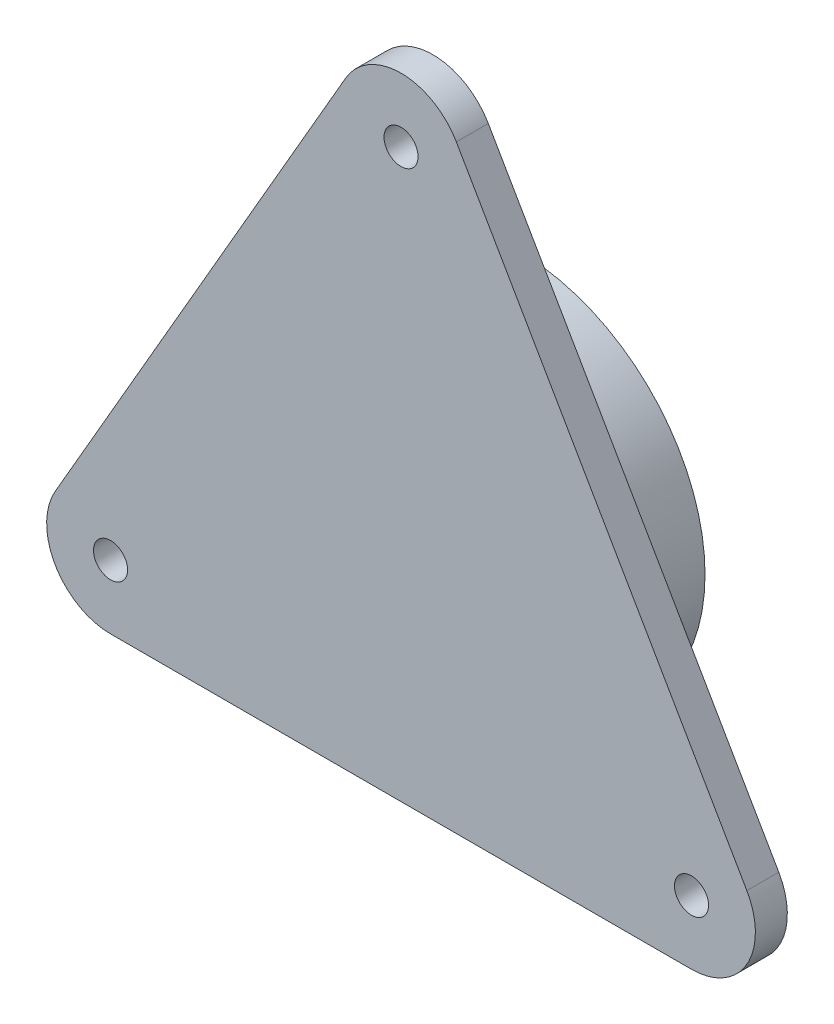
ISO-10303-21;
HEADER;
FILE_DESCRIPTION(('STEP AP214'),'2;1');
FILE_NAME('part.step','',(''),(''),'','','');
FILE_SCHEMA(('AUTOMOTIVE_DESIGN { 1 0 10303 214 1 1 1 1 }'));
ENDSEC;
DATA;
#1=APPLICATION_CONTEXT('core data for automotive mechanical design processes');
#2=APPLICATION_PROTOCOL_DEFINITION('international standard','automotive_design',2000,#1);
#3=PRODUCT_CONTEXT('',#1,'mechanical');
#4=PRODUCT('Part','Part','',(#3));
#5=PRODUCT_RELATED_PRODUCT_CATEGORY('part','',(#4));
#6=PRODUCT_DEFINITION_FORMATION('','',#4);
#7=PRODUCT_DEFINITION_CONTEXT('part definition',#1,'design');
#8=PRODUCT_DEFINITION('design','',#6,#7);
#9=PRODUCT_DEFINITION_SHAPE('','',#8);
#10=(LENGTH_UNIT() NAMED_UNIT(*) SI_UNIT(.MILLI.,.METRE.));
#11=(NAMED_UNIT(*) PLANE_ANGLE_UNIT() SI_UNIT($,.RADIAN.));
#12=(NAMED_UNIT(*) SI_UNIT($,.STERADIAN.) SOLID_ANGLE_UNIT());
#13=UNCERTAINTY_MEASURE_WITH_UNIT(LENGTH_MEASURE(1.E-05),#10,'distance_accuracy_value','');
#14=(GEOMETRIC_REPRESENTATION_CONTEXT(3) GLOBAL_UNCERTAINTY_ASSIGNED_CONTEXT((#13)) GLOBAL_UNIT_ASSIGNED_CONTEXT((#10,
#11,#12)) REPRESENTATION_CONTEXT('',''));
#15=CARTESIAN_POINT('',(0.,0.,0.));
#16=DIRECTION('',(0.,0.,1.));
#17=DIRECTION('',(1.,0.,0.));
#18=AXIS2_PLACEMENT_3D('',#15,#16,#17);
#19=CARTESIAN_POINT('',(0.,45.,-3.));
#20=DIRECTION('',(0.,0.,1.));
#21=DIRECTION('',(-1.,0.,0.));
#22=AXIS2_PLACEMENT_3D('',#19,#20,#21);
#23=PLANE('',#22);
#24=CARTESIAN_POINT('',(-27.2798002192098,-15.75,-3.));
#25=DIRECTION('',(0.,0.,-1.));
#26=DIRECTION('',(-1.,0.,0.));
#27=AXIS2_PLACEMENT_3D('',#24,#25,#26);
#28=CIRCLE('',#27,4.);
#29=CARTESIAN_POINT('',(-31.2798002192098,-15.75,-3.));
#30=VERTEX_POINT('',#29);
#31=EDGE_CURVE('E239',#30,#30,#28,.T.);
#32=ORIENTED_EDGE('',*,*,#31,.F.);
#33=EDGE_LOOP('',(#32));
#34=FACE_BOUND('',#33,.T.);
#35=CARTESIAN_POINT('',(27.2798002192098,-15.75,-3.));
#36=DIRECTION('',(0.,0.,-1.));
#37=DIRECTION('',(-1.,0.,0.));
#38=AXIS2_PLACEMENT_3D('',#35,#36,#37);
#39=CIRCLE('',#38,4.00000000000001);
#40=CARTESIAN_POINT('',(23.2798002192098,-15.75,-3.));
#41=VERTEX_POINT('',#40);
#42=EDGE_CURVE('E236',#41,#41,#39,.T.);
#43=ORIENTED_EDGE('',*,*,#42,.F.);
#44=EDGE_LOOP('',(#43));
#45=FACE_BOUND('',#44,.T.);
#46=CARTESIAN_POINT('',(0.,31.5,-3.));
#47=DIRECTION('',(0.,0.,-1.));
#48=DIRECTION('',(-1.,0.,0.));
#49=AXIS2_PLACEMENT_3D('',#46,#47,#48);
#50=CIRCLE('',#49,4.);
#51=CARTESIAN_POINT('',(-4.,31.5,-3.));
#52=VERTEX_POINT('',#51);
#53=EDGE_CURVE('E233',#52,#52,#50,.T.);
#54=ORIENTED_EDGE('',*,*,#53,.F.);
#55=EDGE_LOOP('',(#54));
#56=FACE_BOUND('',#55,.T.);
#57=CARTESIAN_POINT('',(0.,0.,-3.));
#58=DIRECTION('',(0.,0.,1.));
#59=DIRECTION('',(1.,0.,0.));
#60=AXIS2_PLACEMENT_3D('',#57,#58,#59);
#61=CIRCLE('',#60,19.55);
#62=CARTESIAN_POINT('',(19.55,0.,-3.));
#63=VERTEX_POINT('',#62);
#64=EDGE_CURVE('E188',#63,#63,#61,.T.);
#65=ORIENTED_EDGE('',*,*,#64,.T.);
#66=EDGE_LOOP('',(#65));
#67=FACE_BOUND('',#66,.T.);
#68=DIRECTION('',(0.5,-0.866025403784439,0.));
#69=VECTOR('',#68,1.);
#70=CARTESIAN_POINT('',(5.19615242270663,34.5,-3.));
#71=LINE('',#70,#69);
#72=CARTESIAN_POINT('',(5.19615242270663,34.5,-3.));
#73=VERTEX_POINT('',#72);
#74=CARTESIAN_POINT('',(32.4759526419165,-12.75,-3.));
#75=VERTEX_POINT('',#74);
#76=EDGE_CURVE('E106',#73,#75,#71,.T.);
#77=ORIENTED_EDGE('',*,*,#76,.T.);
#78=CARTESIAN_POINT('',(27.2798002192098,-15.75,-3.));
#79=DIRECTION('',(0.,0.,-1.));
#80=DIRECTION('',(-1.,0.,0.));
#81=AXIS2_PLACEMENT_3D('',#78,#79,#80);
#82=CIRCLE('',#81,6.);
#83=CARTESIAN_POINT('',(27.2798002192098,-21.75,-3.));
#84=VERTEX_POINT('',#83);
#85=EDGE_CURVE('E138',#75,#84,#82,.T.);
#86=ORIENTED_EDGE('',*,*,#85,.T.);
#87=DIRECTION('',(-1.,0.,0.));
#88=VECTOR('',#87,1.);
#89=CARTESIAN_POINT('',(27.2798002192098,-21.75,-3.));
#90=LINE('',#89,#88);
#91=CARTESIAN_POINT('',(-27.2798002192098,-21.75,-3.));
#92=VERTEX_POINT('',#91);
#93=EDGE_CURVE('E141',#84,#92,#90,.T.);
#94=ORIENTED_EDGE('',*,*,#93,.T.);
#95=CARTESIAN_POINT('',(-27.2798002192098,-15.75,-3.));
#96=DIRECTION('',(0.,0.,-1.));
#97=DIRECTION('',(-1.,0.,0.));
#98=AXIS2_PLACEMENT_3D('',#95,#96,#97);
#99=CIRCLE('',#98,6.00000000000001);
#100=CARTESIAN_POINT('',(-32.4759526419165,-12.75,-3.));
#101=VERTEX_POINT('',#100);
#102=EDGE_CURVE('E144',#92,#101,#99,.T.);
#103=ORIENTED_EDGE('',*,*,#102,.T.);
#104=DIRECTION('',(0.5,0.866025403784438,0.));
#105=VECTOR('',#104,1.);
#106=CARTESIAN_POINT('',(-5.19615242270663,34.5,-3.));
#107=LINE('',#106,#105);
#108=CARTESIAN_POINT('',(-5.19615242270664,34.5,-3.));
#109=VERTEX_POINT('',#108);
#110=EDGE_CURVE('E116',#101,#109,#107,.T.);
#111=ORIENTED_EDGE('',*,*,#110,.T.);
#112=CARTESIAN_POINT('',(0.,31.5,-3.));
#113=DIRECTION('',(0.,0.,-1.));
#114=DIRECTION('',(-1.,0.,0.));
#115=AXIS2_PLACEMENT_3D('',#112,#113,#114);
#116=CIRCLE('',#115,6.);
#117=EDGE_CURVE('E134',#109,#73,#116,.T.);
#118=ORIENTED_EDGE('',*,*,#117,.T.);
#119=EDGE_LOOP('',(#77,#86,#94,#103,#111,#118));
#120=FACE_BOUND('',#119,.T.);
#121=ADVANCED_FACE('F43',(#34,#45,#56,#67,#120),#23,.F.);
#122=CARTESIAN_POINT('',(0.,17.55,-3.5));
#123=DIRECTION('',(0.,0.,1.));
#124=DIRECTION('',(-1.,0.,0.));
#125=AXIS2_PLACEMENT_3D('',#122,#123,#124);
#126=PLANE('',#125);
#127=CARTESIAN_POINT('',(0.,0.,-3.5));
#128=DIRECTION('',(0.,0.,1.));
#129=DIRECTION('',(1.,0.,0.));
#130=AXIS2_PLACEMENT_3D('',#127,#128,#129);
#131=CIRCLE('',#130,17.55);
#132=CARTESIAN_POINT('',(17.55,0.,-3.5));
#133=VERTEX_POINT('',#132);
#134=EDGE_CURVE('E177',#133,#133,#131,.T.);
#135=ORIENTED_EDGE('',*,*,#134,.T.);
#136=EDGE_LOOP('',(#135));
#137=FACE_BOUND('',#136,.T.);
#138=CARTESIAN_POINT('',(0.,0.,-3.5));
#139=DIRECTION('',(0.,0.,1.));
#140=DIRECTION('',(1.,0.,0.));
#141=AXIS2_PLACEMENT_3D('',#138,#139,#140);
#142=CIRCLE('',#141,19.55);
#143=CARTESIAN_POINT('',(19.55,0.,-3.5));
#144=VERTEX_POINT('',#143);
#145=EDGE_CURVE('E191',#144,#144,#142,.T.);
#146=ORIENTED_EDGE('',*,*,#145,.F.);
#147=EDGE_LOOP('',(#146));
#148=FACE_BOUND('',#147,.T.);
#149=ADVANCED_FACE('F317',(#137,#148),#126,.F.);
#150=CARTESIAN_POINT('',(0.,0.,-11.));
#151=DIRECTION('',(0.,0.,-1.));
#152=DIRECTION('',(1.,0.,0.));
#153=AXIS2_PLACEMENT_3D('',#150,#151,#152);
#154=CYLINDRICAL_SURFACE('',#153,19.55);
#155=ORIENTED_EDGE('',*,*,#145,.T.);
#156=EDGE_LOOP('',(#155));
#157=FACE_BOUND('',#156,.T.);
#158=ORIENTED_EDGE('',*,*,#64,.F.);
#159=EDGE_LOOP('',(#158));
#160=FACE_BOUND('',#159,.T.);
#161=ADVANCED_FACE('F323',(#157,#160),#154,.T.);
#162=CARTESIAN_POINT('',(0.,0.,0.));
#163=DIRECTION('',(0.,0.,-1.));
#164=DIRECTION('',(1.,0.,0.));
#165=AXIS2_PLACEMENT_3D('',#162,#163,#164);
#166=PLANE('',#165);
#167=DIRECTION('',(0.5,0.866025403784438,0.));
#168=VECTOR('',#167,1.);
#169=CARTESIAN_POINT('',(-5.19615242270663,34.5,0.));
#170=LINE('',#169,#168);
#171=CARTESIAN_POINT('',(-32.4759526419165,-12.75,0.));
#172=VERTEX_POINT('',#171);
#173=CARTESIAN_POINT('',(-5.19615242270664,34.5,0.));
#174=VERTEX_POINT('',#173);
#175=EDGE_CURVE('E132',#172,#174,#170,.T.);
#176=ORIENTED_EDGE('',*,*,#175,.F.);
#177=CARTESIAN_POINT('',(-27.2798002192098,-15.75,0.));
#178=DIRECTION('',(0.,0.,-1.));
#179=DIRECTION('',(-1.,0.,0.));
#180=AXIS2_PLACEMENT_3D('',#177,#178,#179);
#181=CIRCLE('',#180,6.00000000000001);
#182=CARTESIAN_POINT('',(-27.2798002192098,-21.75,0.));
#183=VERTEX_POINT('',#182);
#184=EDGE_CURVE('E130',#183,#172,#181,.T.);
#185=ORIENTED_EDGE('',*,*,#184,.F.);
#186=DIRECTION('',(-1.,0.,0.));
#187=VECTOR('',#186,1.);
#188=CARTESIAN_POINT('',(27.2798002192098,-21.75,0.));
#189=LINE('',#188,#187);
#190=CARTESIAN_POINT('',(27.2798002192098,-21.75,0.));
#191=VERTEX_POINT('',#190);
#192=EDGE_CURVE('E124',#191,#183,#189,.T.);
#193=ORIENTED_EDGE('',*,*,#192,.F.);
#194=CARTESIAN_POINT('',(27.2798002192098,-15.75,0.));
#195=DIRECTION('',(0.,0.,-1.));
#196=DIRECTION('',(-1.,0.,0.));
#197=AXIS2_PLACEMENT_3D('',#194,#195,#196);
#198=CIRCLE('',#197,6.);
#199=CARTESIAN_POINT('',(32.4759526419165,-12.75,0.));
#200=VERTEX_POINT('',#199);
#201=EDGE_CURVE('E122',#200,#191,#198,.T.);
#202=ORIENTED_EDGE('',*,*,#201,.F.);
#203=DIRECTION('',(0.5,-0.866025403784439,0.));
#204=VECTOR('',#203,1.);
#205=CARTESIAN_POINT('',(5.19615242270663,34.5,0.));
#206=LINE('',#205,#204);
#207=CARTESIAN_POINT('',(5.19615242270663,34.5,0.));
#208=VERTEX_POINT('',#207);
#209=EDGE_CURVE('E103',#208,#200,#206,.T.);
#210=ORIENTED_EDGE('',*,*,#209,.F.);
#211=CARTESIAN_POINT('',(0.,31.5,0.));
#212=DIRECTION('',(0.,0.,-1.));
#213=DIRECTION('',(-1.,0.,0.));
#214=AXIS2_PLACEMENT_3D('',#211,#212,#213);
#215=CIRCLE('',#214,6.);
#216=EDGE_CURVE('E111',#174,#208,#215,.T.);
#217=ORIENTED_EDGE('',*,*,#216,.F.);
#218=EDGE_LOOP('',(#176,#185,#193,#202,#210,#217));
#219=FACE_BOUND('',#218,.T.);
#220=CARTESIAN_POINT('',(0.,31.5,0.));
#221=DIRECTION('',(0.,0.,-1.));
#222=DIRECTION('',(0.,1.,0.));
#223=AXIS2_PLACEMENT_3D('',#220,#221,#222);
#224=CIRCLE('',#223,1.6);
#225=CARTESIAN_POINT('',(0.,33.1,0.));
#226=VERTEX_POINT('',#225);
#227=EDGE_CURVE('E174',#226,#226,#224,.T.);
#228=ORIENTED_EDGE('',*,*,#227,.T.);
#229=EDGE_LOOP('',(#228));
#230=FACE_BOUND('',#229,.T.);
#231=CARTESIAN_POINT('',(-27.2798002192098,-15.75,0.));
#232=DIRECTION('',(0.,0.,-1.));
#233=DIRECTION('',(0.,1.,0.));
#234=AXIS2_PLACEMENT_3D('',#231,#232,#233);
#235=CIRCLE('',#234,1.60000000000002);
#236=CARTESIAN_POINT('',(-27.2798002192098,-14.15,0.));
#237=VERTEX_POINT('',#236);
#238=EDGE_CURVE('E178',#237,#237,#235,.T.);
#239=ORIENTED_EDGE('',*,*,#238,.T.);
#240=EDGE_LOOP('',(#239));
#241=FACE_BOUND('',#240,.T.);
#242=CARTESIAN_POINT('',(27.2798002192098,-15.75,0.));
#243=DIRECTION('',(0.,0.,-1.));
#244=DIRECTION('',(0.,1.,0.));
#245=AXIS2_PLACEMENT_3D('',#242,#243,#244);
#246=CIRCLE('',#245,1.6);
#247=CARTESIAN_POINT('',(27.2798002192098,-14.15,0.));
#248=VERTEX_POINT('',#247);
#249=EDGE_CURVE('E173',#248,#248,#246,.T.);
#250=ORIENTED_EDGE('',*,*,#249,.T.);
#251=EDGE_LOOP('',(#250));
#252=FACE_BOUND('',#251,.T.);
#253=ADVANCED_FACE('F118',(#219,#230,#241,#252),#166,.F.);
#254=CARTESIAN_POINT('',(0.,17.55,-11.));
#255=DIRECTION('',(0.,0.,1.));
#256=DIRECTION('',(-1.,0.,0.));
#257=AXIS2_PLACEMENT_3D('',#254,#255,#256);
#258=PLANE('',#257);
#259=CARTESIAN_POINT('',(-9.,-9.,-11.));
#260=DIRECTION('',(0.,0.,-1.));
#261=DIRECTION('',(-1.,0.,0.));
#262=AXIS2_PLACEMENT_3D('',#259,#260,#261);
#263=CIRCLE('',#262,2.9);
#264=CARTESIAN_POINT('',(-11.9,-9.,-11.));
#265=VERTEX_POINT('',#264);
#266=EDGE_CURVE('E212',#265,#265,#263,.T.);
#267=ORIENTED_EDGE('',*,*,#266,.F.);
#268=EDGE_LOOP('',(#267));
#269=FACE_BOUND('',#268,.T.);
#270=CARTESIAN_POINT('',(9.,-9.,-11.));
#271=DIRECTION('',(0.,0.,-1.));
#272=DIRECTION('',(-1.,0.,0.));
#273=AXIS2_PLACEMENT_3D('',#270,#271,#272);
#274=CIRCLE('',#273,2.9);
#275=CARTESIAN_POINT('',(6.1,-9.,-11.));
#276=VERTEX_POINT('',#275);
#277=EDGE_CURVE('E209',#276,#276,#274,.T.);
#278=ORIENTED_EDGE('',*,*,#277,.F.);
#279=EDGE_LOOP('',(#278));
#280=FACE_BOUND('',#279,.T.);
#281=CARTESIAN_POINT('',(9.,9.,-11.));
#282=DIRECTION('',(0.,0.,-1.));
#283=DIRECTION('',(-1.,0.,0.));
#284=AXIS2_PLACEMENT_3D('',#281,#282,#283);
#285=CIRCLE('',#284,2.9);
#286=CARTESIAN_POINT('',(6.1,9.,-11.));
#287=VERTEX_POINT('',#286);
#288=EDGE_CURVE('E206',#287,#287,#285,.T.);
#289=ORIENTED_EDGE('',*,*,#288,.F.);
#290=EDGE_LOOP('',(#289));
#291=FACE_BOUND('',#290,.T.);
#292=CARTESIAN_POINT('',(-9.,9.,-11.));
#293=DIRECTION('',(0.,0.,-1.));
#294=DIRECTION('',(-1.,0.,0.));
#295=AXIS2_PLACEMENT_3D('',#292,#293,#294);
#296=CIRCLE('',#295,2.9);
#297=CARTESIAN_POINT('',(-11.9,9.,-11.));
#298=VERTEX_POINT('',#297);
#299=EDGE_CURVE('E203',#298,#298,#296,.T.);
#300=ORIENTED_EDGE('',*,*,#299,.F.);
#301=EDGE_LOOP('',(#300));
#302=FACE_BOUND('',#301,.T.);
#303=CARTESIAN_POINT('',(0.,-4.,-11.));
#304=DIRECTION('',(0.,0.,-1.));
#305=DIRECTION('',(-1.,0.,0.));
#306=AXIS2_PLACEMENT_3D('',#303,#304,#305);
#307=CIRCLE('',#306,2.9);
#308=CARTESIAN_POINT('',(-2.9,-4.,-11.));
#309=VERTEX_POINT('',#308);
#310=EDGE_CURVE('E200',#309,#309,#307,.T.);
#311=ORIENTED_EDGE('',*,*,#310,.F.);
#312=EDGE_LOOP('',(#311));
#313=FACE_BOUND('',#312,.T.);
#314=CARTESIAN_POINT('',(0.,4.,-11.));
#315=DIRECTION('',(0.,0.,-1.));
#316=DIRECTION('',(-1.,0.,0.));
#317=AXIS2_PLACEMENT_3D('',#314,#315,#316);
#318=CIRCLE('',#317,2.9);
#319=CARTESIAN_POINT('',(-2.9,4.,-11.));
#320=VERTEX_POINT('',#319);
#321=EDGE_CURVE('E197',#320,#320,#318,.T.);
#322=ORIENTED_EDGE('',*,*,#321,.F.);
#323=EDGE_LOOP('',(#322));
#324=FACE_BOUND('',#323,.T.);
#325=CARTESIAN_POINT('',(0.,0.,-11.));
#326=DIRECTION('',(0.,0.,1.));
#327=DIRECTION('',(1.,0.,0.));
#328=AXIS2_PLACEMENT_3D('',#325,#326,#327);
#329=CIRCLE('',#328,17.55);
#330=CARTESIAN_POINT('',(17.55,0.,-11.));
#331=VERTEX_POINT('',#330);
#332=EDGE_CURVE('E185',#331,#331,#329,.T.);
#333=ORIENTED_EDGE('',*,*,#332,.F.);
#334=EDGE_LOOP('',(#333));
#335=FACE_BOUND('',#334,.T.);
#336=ADVANCED_FACE('F466',(#269,#280,#291,#302,#313,#324,#335),#258,.F.);
#337=CARTESIAN_POINT('',(0.,0.,-11.));
#338=DIRECTION('',(0.,0.,-1.));
#339=DIRECTION('',(1.,0.,0.));
#340=AXIS2_PLACEMENT_3D('',#337,#338,#339);
#341=CYLINDRICAL_SURFACE('',#340,17.55);
#342=ORIENTED_EDGE('',*,*,#332,.T.);
#343=EDGE_LOOP('',(#342));
#344=FACE_BOUND('',#343,.T.);
#345=ORIENTED_EDGE('',*,*,#134,.F.);
#346=EDGE_LOOP('',(#345));
#347=FACE_BOUND('',#346,.T.);
#348=ADVANCED_FACE('F463',(#344,#347),#341,.T.);
#349=CARTESIAN_POINT('',(27.2798002192098,-15.75,-11.));
#350=DIRECTION('',(0.,0.,1.));
#351=DIRECTION('',(0.,1.,0.));
#352=AXIS2_PLACEMENT_3D('',#349,#350,#351);
#353=CYLINDRICAL_SURFACE('',#352,1.6);
#354=ORIENTED_EDGE('',*,*,#249,.F.);
#355=EDGE_LOOP('',(#354));
#356=FACE_BOUND('',#355,.T.);
#357=CARTESIAN_POINT('',(27.2798002192098,-15.75,-5.));
#358=DIRECTION('',(0.,0.,1.));
#359=DIRECTION('',(1.,0.,0.));
#360=AXIS2_PLACEMENT_3D('',#357,#358,#359);
#361=CIRCLE('',#360,1.6);
#362=CARTESIAN_POINT('',(28.8798002192098,-15.75,-5.));
#363=VERTEX_POINT('',#362);
#364=EDGE_CURVE('E265',#363,#363,#361,.T.);
#365=ORIENTED_EDGE('',*,*,#364,.F.);
#366=EDGE_LOOP('',(#365));
#367=FACE_BOUND('',#366,.T.);
#368=ADVANCED_FACE('F459',(#356,#367),#353,.F.);
#369=CARTESIAN_POINT('',(-27.2798002192098,-15.75,-11.));
#370=DIRECTION('',(0.,0.,1.));
#371=DIRECTION('',(0.,1.,0.));
#372=AXIS2_PLACEMENT_3D('',#369,#370,#371);
#373=CYLINDRICAL_SURFACE('',#372,1.60000000000002);
#374=ORIENTED_EDGE('',*,*,#238,.F.);
#375=EDGE_LOOP('',(#374));
#376=FACE_BOUND('',#375,.T.);
#377=CARTESIAN_POINT('',(-27.2798002192098,-15.75,-5.));
#378=DIRECTION('',(0.,0.,1.));
#379=DIRECTION('',(1.,0.,0.));
#380=AXIS2_PLACEMENT_3D('',#377,#378,#379);
#381=CIRCLE('',#380,1.6);
#382=CARTESIAN_POINT('',(-25.6798002192098,-15.75,-5.));
#383=VERTEX_POINT('',#382);
#384=EDGE_CURVE('E272',#383,#383,#381,.T.);
#385=ORIENTED_EDGE('',*,*,#384,.F.);
#386=EDGE_LOOP('',(#385));
#387=FACE_BOUND('',#386,.T.);
#388=ADVANCED_FACE('F455',(#376,#387),#373,.F.);
#389=CARTESIAN_POINT('',(0.,31.5,-11.));
#390=DIRECTION('',(0.,0.,1.));
#391=DIRECTION('',(0.,1.,0.));
#392=AXIS2_PLACEMENT_3D('',#389,#390,#391);
#393=CYLINDRICAL_SURFACE('',#392,1.6);
#394=ORIENTED_EDGE('',*,*,#227,.F.);
#395=EDGE_LOOP('',(#394));
#396=FACE_BOUND('',#395,.T.);
#397=CARTESIAN_POINT('',(0.,31.5,-5.));
#398=DIRECTION('',(0.,0.,1.));
#399=DIRECTION('',(1.,0.,0.));
#400=AXIS2_PLACEMENT_3D('',#397,#398,#399);
#401=CIRCLE('',#400,1.6);
#402=CARTESIAN_POINT('',(1.6,31.5,-5.));
#403=VERTEX_POINT('',#402);
#404=EDGE_CURVE('E275',#403,#403,#401,.T.);
#405=ORIENTED_EDGE('',*,*,#404,.F.);
#406=EDGE_LOOP('',(#405));
#407=FACE_BOUND('',#406,.T.);
#408=ADVANCED_FACE('F451',(#396,#407),#393,.F.);
#409=CARTESIAN_POINT('',(0.,4.,-7.));
#410=DIRECTION('',(0.,0.,-1.));
#411=DIRECTION('',(1.,0.,0.));
#412=AXIS2_PLACEMENT_3D('',#409,#410,#411);
#413=CYLINDRICAL_SURFACE('',#412,2.4);
#414=CARTESIAN_POINT('',(0.,4.,-10.5));
#415=DIRECTION('',(0.,0.,-1.));
#416=DIRECTION('',(-1.,0.,0.));
#417=AXIS2_PLACEMENT_3D('',#414,#415,#416);
#418=CIRCLE('',#417,2.4);
#419=CARTESIAN_POINT('',(-2.4,4.,-10.5));
#420=VERTEX_POINT('',#419);
#421=EDGE_CURVE('E227',#420,#420,#418,.F.);
#422=ORIENTED_EDGE('',*,*,#421,.F.);
#423=EDGE_LOOP('',(#422));
#424=FACE_BOUND('',#423,.T.);
#425=CARTESIAN_POINT('',(0.,4.,-7.));
#426=DIRECTION('',(0.,0.,1.));
#427=DIRECTION('',(1.,0.,0.));
#428=AXIS2_PLACEMENT_3D('',#425,#426,#427);
#429=CIRCLE('',#428,2.4);
#430=CARTESIAN_POINT('',(2.4,4.,-7.));
#431=VERTEX_POINT('',#430);
#432=EDGE_CURVE('E162',#431,#431,#429,.T.);
#433=ORIENTED_EDGE('',*,*,#432,.T.);
#434=EDGE_LOOP('',(#433));
#435=FACE_BOUND('',#434,.T.);
#436=ADVANCED_FACE('F448',(#424,#435),#413,.F.);
#437=CARTESIAN_POINT('',(0.,4.,-7.));
#438=DIRECTION('',(0.,0.,-1.));
#439=DIRECTION('',(1.,0.,0.));
#440=AXIS2_PLACEMENT_3D('',#437,#438,#439);
#441=PLANE('',#440);
#442=CARTESIAN_POINT('',(0.,4.,-7.));
#443=DIRECTION('',(0.,0.,1.));
#444=DIRECTION('',(1.,0.,0.));
#445=AXIS2_PLACEMENT_3D('',#442,#443,#444);
#446=CIRCLE('',#445,1.75);
#447=CARTESIAN_POINT('',(1.75,4.,-7.));
#448=VERTEX_POINT('',#447);
#449=EDGE_CURVE('E47',#448,#448,#446,.T.);
#450=ORIENTED_EDGE('',*,*,#449,.T.);
#451=EDGE_LOOP('',(#450));
#452=FACE_BOUND('',#451,.T.);
#453=ORIENTED_EDGE('',*,*,#432,.F.);
#454=EDGE_LOOP('',(#453));
#455=FACE_BOUND('',#454,.T.);
#456=ADVANCED_FACE('F411',(#452,#455),#441,.T.);
#457=CARTESIAN_POINT('',(-9.,-9.,-7.));
#458=DIRECTION('',(0.,0.,-1.));
#459=DIRECTION('',(1.,0.,0.));
#460=AXIS2_PLACEMENT_3D('',#457,#458,#459);
#461=CYLINDRICAL_SURFACE('',#460,2.4);
#462=CARTESIAN_POINT('',(-9.,-9.,-10.5));
#463=DIRECTION('',(0.,0.,-1.));
#464=DIRECTION('',(-1.,0.,0.));
#465=AXIS2_PLACEMENT_3D('',#462,#463,#464);
#466=CIRCLE('',#465,2.4);
#467=CARTESIAN_POINT('',(-11.4,-9.,-10.5));
#468=VERTEX_POINT('',#467);
#469=EDGE_CURVE('E194',#468,#468,#466,.F.);
#470=ORIENTED_EDGE('',*,*,#469,.F.);
#471=EDGE_LOOP('',(#470));
#472=FACE_BOUND('',#471,.T.);
#473=CARTESIAN_POINT('',(-9.,-9.,-7.));
#474=DIRECTION('',(0.,0.,1.));
#475=DIRECTION('',(1.,0.,0.));
#476=AXIS2_PLACEMENT_3D('',#473,#474,#475);
#477=CIRCLE('',#476,2.4);
#478=CARTESIAN_POINT('',(-6.6,-9.,-7.));
#479=VERTEX_POINT('',#478);
#480=EDGE_CURVE('E108',#479,#479,#477,.T.);
#481=ORIENTED_EDGE('',*,*,#480,.T.);
#482=EDGE_LOOP('',(#481));
#483=FACE_BOUND('',#482,.T.);
#484=ADVANCED_FACE('F407',(#472,#483),#461,.F.);
#485=CARTESIAN_POINT('',(-9.,-9.,-7.));
#486=DIRECTION('',(0.,0.,-1.));
#487=DIRECTION('',(1.,0.,0.));
#488=AXIS2_PLACEMENT_3D('',#485,#486,#487);
#489=PLANE('',#488);
#490=CARTESIAN_POINT('',(-9.,-9.,-7.));
#491=DIRECTION('',(0.,0.,1.));
#492=DIRECTION('',(1.,0.,0.));
#493=AXIS2_PLACEMENT_3D('',#490,#491,#492);
#494=CIRCLE('',#493,1.75);
#495=CARTESIAN_POINT('',(-7.25,-9.,-7.));
#496=VERTEX_POINT('',#495);
#497=EDGE_CURVE('E256',#496,#496,#494,.T.);
#498=ORIENTED_EDGE('',*,*,#497,.T.);
#499=EDGE_LOOP('',(#498));
#500=FACE_BOUND('',#499,.T.);
#501=ORIENTED_EDGE('',*,*,#480,.F.);
#502=EDGE_LOOP('',(#501));
#503=FACE_BOUND('',#502,.T.);
#504=ADVANCED_FACE('F410',(#500,#503),#489,.T.);
#505=CARTESIAN_POINT('',(9.,-9.,-7.));
#506=DIRECTION('',(0.,0.,-1.));
#507=DIRECTION('',(1.,0.,0.));
#508=AXIS2_PLACEMENT_3D('',#505,#506,#507);
#509=CYLINDRICAL_SURFACE('',#508,2.4);
#510=CARTESIAN_POINT('',(9.,-9.,-10.5));
#511=DIRECTION('',(0.,0.,-1.));
#512=DIRECTION('',(-1.,0.,0.));
#513=AXIS2_PLACEMENT_3D('',#510,#511,#512);
#514=CIRCLE('',#513,2.4);
#515=CARTESIAN_POINT('',(6.6,-9.,-10.5));
#516=VERTEX_POINT('',#515);
#517=EDGE_CURVE('E215',#516,#516,#514,.F.);
#518=ORIENTED_EDGE('',*,*,#517,.F.);
#519=EDGE_LOOP('',(#518));
#520=FACE_BOUND('',#519,.T.);
#521=CARTESIAN_POINT('',(9.,-9.,-7.));
#522=DIRECTION('',(0.,0.,1.));
#523=DIRECTION('',(1.,0.,0.));
#524=AXIS2_PLACEMENT_3D('',#521,#522,#523);
#525=CIRCLE('',#524,2.4);
#526=CARTESIAN_POINT('',(11.4,-9.,-7.));
#527=VERTEX_POINT('',#526);
#528=EDGE_CURVE('E158',#527,#527,#525,.T.);
#529=ORIENTED_EDGE('',*,*,#528,.T.);
#530=EDGE_LOOP('',(#529));
#531=FACE_BOUND('',#530,.T.);
#532=ADVANCED_FACE('F415',(#520,#531),#509,.F.);
#533=CARTESIAN_POINT('',(9.,-9.,-7.));
#534=DIRECTION('',(0.,0.,-1.));
#535=DIRECTION('',(1.,0.,0.));
#536=AXIS2_PLACEMENT_3D('',#533,#534,#535);
#537=PLANE('',#536);
#538=CARTESIAN_POINT('',(9.,-9.,-7.));
#539=DIRECTION('',(0.,0.,1.));
#540=DIRECTION('',(1.,0.,0.));
#541=AXIS2_PLACEMENT_3D('',#538,#539,#540);
#542=CIRCLE('',#541,1.75);
#543=CARTESIAN_POINT('',(10.75,-9.,-7.));
#544=VERTEX_POINT('',#543);
#545=EDGE_CURVE('E254',#544,#544,#542,.T.);
#546=ORIENTED_EDGE('',*,*,#545,.T.);
#547=EDGE_LOOP('',(#546));
#548=FACE_BOUND('',#547,.T.);
#549=ORIENTED_EDGE('',*,*,#528,.F.);
#550=EDGE_LOOP('',(#549));
#551=FACE_BOUND('',#550,.T.);
#552=ADVANCED_FACE('F435',(#548,#551),#537,.T.);
#553=CARTESIAN_POINT('',(9.,9.,-7.));
#554=DIRECTION('',(0.,0.,-1.));
#555=DIRECTION('',(1.,0.,0.));
#556=AXIS2_PLACEMENT_3D('',#553,#554,#555);
#557=CYLINDRICAL_SURFACE('',#556,2.4);
#558=CARTESIAN_POINT('',(9.,9.,-10.5));
#559=DIRECTION('',(0.,0.,-1.));
#560=DIRECTION('',(-1.,0.,0.));
#561=AXIS2_PLACEMENT_3D('',#558,#559,#560);
#562=CIRCLE('',#561,2.4);
#563=CARTESIAN_POINT('',(6.6,9.,-10.5));
#564=VERTEX_POINT('',#563);
#565=EDGE_CURVE('E218',#564,#564,#562,.F.);
#566=ORIENTED_EDGE('',*,*,#565,.F.);
#567=EDGE_LOOP('',(#566));
#568=FACE_BOUND('',#567,.T.);
#569=CARTESIAN_POINT('',(9.,9.,-7.));
#570=DIRECTION('',(0.,0.,1.));
#571=DIRECTION('',(1.,0.,0.));
#572=AXIS2_PLACEMENT_3D('',#569,#570,#571);
#573=CIRCLE('',#572,2.4);
#574=CARTESIAN_POINT('',(11.4,9.,-7.));
#575=VERTEX_POINT('',#574);
#576=EDGE_CURVE('E166',#575,#575,#573,.T.);
#577=ORIENTED_EDGE('',*,*,#576,.T.);
#578=EDGE_LOOP('',(#577));
#579=FACE_BOUND('',#578,.T.);
#580=ADVANCED_FACE('F432',(#568,#579),#557,.F.);
#581=CARTESIAN_POINT('',(9.,9.,-7.));
#582=DIRECTION('',(0.,0.,-1.));
#583=DIRECTION('',(1.,0.,0.));
#584=AXIS2_PLACEMENT_3D('',#581,#582,#583);
#585=PLANE('',#584);
#586=CARTESIAN_POINT('',(9.,9.,-7.));
#587=DIRECTION('',(0.,0.,1.));
#588=DIRECTION('',(1.,0.,0.));
#589=AXIS2_PLACEMENT_3D('',#586,#587,#588);
#590=CIRCLE('',#589,1.75);
#591=CARTESIAN_POINT('',(10.75,9.,-7.));
#592=VERTEX_POINT('',#591);
#593=EDGE_CURVE('E251',#592,#592,#590,.T.);
#594=ORIENTED_EDGE('',*,*,#593,.T.);
#595=EDGE_LOOP('',(#594));
#596=FACE_BOUND('',#595,.T.);
#597=ORIENTED_EDGE('',*,*,#576,.F.);
#598=EDGE_LOOP('',(#597));
#599=FACE_BOUND('',#598,.T.);
#600=ADVANCED_FACE('F427',(#596,#599),#585,.T.);
#601=CARTESIAN_POINT('',(-9.,9.,-7.));
#602=DIRECTION('',(0.,0.,-1.));
#603=DIRECTION('',(1.,0.,0.));
#604=AXIS2_PLACEMENT_3D('',#601,#602,#603);
#605=CYLINDRICAL_SURFACE('',#604,2.4);
#606=CARTESIAN_POINT('',(-9.,9.,-10.5));
#607=DIRECTION('',(0.,0.,-1.));
#608=DIRECTION('',(-1.,0.,0.));
#609=AXIS2_PLACEMENT_3D('',#606,#607,#608);
#610=CIRCLE('',#609,2.4);
#611=CARTESIAN_POINT('',(-11.4,9.,-10.5));
#612=VERTEX_POINT('',#611);
#613=EDGE_CURVE('E221',#612,#612,#610,.F.);
#614=ORIENTED_EDGE('',*,*,#613,.F.);
#615=EDGE_LOOP('',(#614));
#616=FACE_BOUND('',#615,.T.);
#617=CARTESIAN_POINT('',(-9.,9.,-7.));
#618=DIRECTION('',(0.,0.,1.));
#619=DIRECTION('',(1.,0.,0.));
#620=AXIS2_PLACEMENT_3D('',#617,#618,#619);
#621=CIRCLE('',#620,2.4);
#622=CARTESIAN_POINT('',(-6.6,9.,-7.));
#623=VERTEX_POINT('',#622);
#624=EDGE_CURVE('E163',#623,#623,#621,.T.);
#625=ORIENTED_EDGE('',*,*,#624,.T.);
#626=EDGE_LOOP('',(#625));
#627=FACE_BOUND('',#626,.T.);
#628=ADVANCED_FACE('F424',(#616,#627),#605,.F.);
#629=CARTESIAN_POINT('',(-9.,9.,-7.));
#630=DIRECTION('',(0.,0.,-1.));
#631=DIRECTION('',(1.,0.,0.));
#632=AXIS2_PLACEMENT_3D('',#629,#630,#631);
#633=PLANE('',#632);
#634=CARTESIAN_POINT('',(-9.,9.,-7.));
#635=DIRECTION('',(0.,0.,1.));
#636=DIRECTION('',(1.,0.,0.));
#637=AXIS2_PLACEMENT_3D('',#634,#635,#636);
#638=CIRCLE('',#637,1.75);
#639=CARTESIAN_POINT('',(-7.25,9.,-7.));
#640=VERTEX_POINT('',#639);
#641=EDGE_CURVE('E247',#640,#640,#638,.T.);
#642=ORIENTED_EDGE('',*,*,#641,.T.);
#643=EDGE_LOOP('',(#642));
#644=FACE_BOUND('',#643,.T.);
#645=ORIENTED_EDGE('',*,*,#624,.F.);
#646=EDGE_LOOP('',(#645));
#647=FACE_BOUND('',#646,.T.);
#648=ADVANCED_FACE('F419',(#644,#647),#633,.T.);
#649=CARTESIAN_POINT('',(0.,-4.,-7.));
#650=DIRECTION('',(0.,0.,-1.));
#651=DIRECTION('',(1.,0.,0.));
#652=AXIS2_PLACEMENT_3D('',#649,#650,#651);
#653=CYLINDRICAL_SURFACE('',#652,2.4);
#654=CARTESIAN_POINT('',(0.,-4.,-10.5));
#655=DIRECTION('',(0.,0.,-1.));
#656=DIRECTION('',(-1.,0.,0.));
#657=AXIS2_PLACEMENT_3D('',#654,#655,#656);
#658=CIRCLE('',#657,2.4);
#659=CARTESIAN_POINT('',(-2.4,-4.,-10.5));
#660=VERTEX_POINT('',#659);
#661=EDGE_CURVE('E224',#660,#660,#658,.F.);
#662=ORIENTED_EDGE('',*,*,#661,.F.);
#663=EDGE_LOOP('',(#662));
#664=FACE_BOUND('',#663,.T.);
#665=CARTESIAN_POINT('',(0.,-4.,-7.));
#666=DIRECTION('',(0.,0.,1.));
#667=DIRECTION('',(1.,0.,0.));
#668=AXIS2_PLACEMENT_3D('',#665,#666,#667);
#669=CIRCLE('',#668,2.4);
#670=CARTESIAN_POINT('',(2.4,-4.,-7.));
#671=VERTEX_POINT('',#670);
#672=EDGE_CURVE('E159',#671,#671,#669,.T.);
#673=ORIENTED_EDGE('',*,*,#672,.T.);
#674=EDGE_LOOP('',(#673));
#675=FACE_BOUND('',#674,.T.);
#676=ADVANCED_FACE('F416',(#664,#675),#653,.F.);
#677=CARTESIAN_POINT('',(0.,-4.,-7.));
#678=DIRECTION('',(0.,0.,-1.));
#679=DIRECTION('',(1.,0.,0.));
#680=AXIS2_PLACEMENT_3D('',#677,#678,#679);
#681=PLANE('',#680);
#682=CARTESIAN_POINT('',(0.,-4.,-7.));
#683=DIRECTION('',(0.,0.,1.));
#684=DIRECTION('',(1.,0.,0.));
#685=AXIS2_PLACEMENT_3D('',#682,#683,#684);
#686=CIRCLE('',#685,1.75);
#687=CARTESIAN_POINT('',(1.75,-4.,-7.));
#688=VERTEX_POINT('',#687);
#689=EDGE_CURVE('E244',#688,#688,#686,.T.);
#690=ORIENTED_EDGE('',*,*,#689,.T.);
#691=EDGE_LOOP('',(#690));
#692=FACE_BOUND('',#691,.T.);
#693=ORIENTED_EDGE('',*,*,#672,.F.);
#694=EDGE_LOOP('',(#693));
#695=FACE_BOUND('',#694,.T.);
#696=ADVANCED_FACE('F406',(#692,#695),#681,.T.);
#697=CARTESIAN_POINT('',(0.,31.5,0.));
#698=DIRECTION('',(0.,0.,-1.));
#699=DIRECTION('',(1.,0.,0.));
#700=AXIS2_PLACEMENT_3D('',#697,#698,#699);
#701=CYLINDRICAL_SURFACE('',#700,6.);
#702=ORIENTED_EDGE('',*,*,#117,.F.);
#703=DIRECTION('',(0.,0.,-1.));
#704=VECTOR('',#703,1.);
#705=CARTESIAN_POINT('',(-5.19615242270663,34.5,0.));
#706=LINE('',#705,#704);
#707=EDGE_CURVE('E68',#174,#109,#706,.T.);
#708=ORIENTED_EDGE('',*,*,#707,.F.);
#709=ORIENTED_EDGE('',*,*,#216,.T.);
#710=DIRECTION('',(0.,0.,-1.));
#711=VECTOR('',#710,1.);
#712=CARTESIAN_POINT('',(5.19615242270663,34.5,0.));
#713=LINE('',#712,#711);
#714=EDGE_CURVE('E100',#208,#73,#713,.T.);
#715=ORIENTED_EDGE('',*,*,#714,.T.);
#716=EDGE_LOOP('',(#702,#708,#709,#715));
#717=FACE_BOUND('',#716,.T.);
#718=ADVANCED_FACE('F112',(#717),#701,.T.);
#719=CARTESIAN_POINT('',(5.19615242270663,34.5,0.));
#720=DIRECTION('',(-0.866025403784438,-0.5,0.));
#721=DIRECTION('',(0.5,-0.866025403784439,0.));
#722=AXIS2_PLACEMENT_3D('',#719,#720,#721);
#723=PLANE('',#722);
#724=ORIENTED_EDGE('',*,*,#76,.F.);
#725=ORIENTED_EDGE('',*,*,#714,.F.);
#726=ORIENTED_EDGE('',*,*,#209,.T.);
#727=DIRECTION('',(0.,0.,-1.));
#728=VECTOR('',#727,1.);
#729=CARTESIAN_POINT('',(32.4759526419165,-12.75,0.));
#730=LINE('',#729,#728);
#731=EDGE_CURVE('E109',#200,#75,#730,.T.);
#732=ORIENTED_EDGE('',*,*,#731,.T.);
#733=EDGE_LOOP('',(#724,#725,#726,#732));
#734=FACE_BOUND('',#733,.T.);
#735=ADVANCED_FACE('F101',(#734),#723,.F.);
#736=CARTESIAN_POINT('',(27.2798002192098,-15.75,0.));
#737=DIRECTION('',(0.,0.,-1.));
#738=DIRECTION('',(1.,0.,0.));
#739=AXIS2_PLACEMENT_3D('',#736,#737,#738);
#740=CYLINDRICAL_SURFACE('',#739,6.);
#741=ORIENTED_EDGE('',*,*,#85,.F.);
#742=ORIENTED_EDGE('',*,*,#731,.F.);
#743=ORIENTED_EDGE('',*,*,#201,.T.);
#744=DIRECTION('',(0.,0.,-1.));
#745=VECTOR('',#744,1.);
#746=CARTESIAN_POINT('',(27.2798002192098,-21.75,0.));
#747=LINE('',#746,#745);
#748=EDGE_CURVE('E153',#191,#84,#747,.T.);
#749=ORIENTED_EDGE('',*,*,#748,.T.);
#750=EDGE_LOOP('',(#741,#742,#743,#749));
#751=FACE_BOUND('',#750,.T.);
#752=ADVANCED_FACE('F397',(#751),#740,.T.);
#753=CARTESIAN_POINT('',(27.2798002192098,-21.75,0.));
#754=DIRECTION('',(0.,1.,0.));
#755=DIRECTION('',(-1.,0.,0.));
#756=AXIS2_PLACEMENT_3D('',#753,#754,#755);
#757=PLANE('',#756);
#758=ORIENTED_EDGE('',*,*,#93,.F.);
#759=ORIENTED_EDGE('',*,*,#748,.F.);
#760=ORIENTED_EDGE('',*,*,#192,.T.);
#761=DIRECTION('',(0.,0.,-1.));
#762=VECTOR('',#761,1.);
#763=CARTESIAN_POINT('',(-27.2798002192098,-21.75,0.));
#764=LINE('',#763,#762);
#765=EDGE_CURVE('E151',#183,#92,#764,.T.);
#766=ORIENTED_EDGE('',*,*,#765,.T.);
#767=EDGE_LOOP('',(#758,#759,#760,#766));
#768=FACE_BOUND('',#767,.T.);
#769=ADVANCED_FACE('F394',(#768),#757,.F.);
#770=CARTESIAN_POINT('',(-27.2798002192098,-15.75,0.));
#771=DIRECTION('',(0.,0.,-1.));
#772=DIRECTION('',(1.,0.,0.));
#773=AXIS2_PLACEMENT_3D('',#770,#771,#772);
#774=CYLINDRICAL_SURFACE('',#773,6.00000000000001);
#775=ORIENTED_EDGE('',*,*,#102,.F.);
#776=ORIENTED_EDGE('',*,*,#765,.F.);
#777=ORIENTED_EDGE('',*,*,#184,.T.);
#778=DIRECTION('',(0.,0.,-1.));
#779=VECTOR('',#778,1.);
#780=CARTESIAN_POINT('',(-32.4759526419165,-12.75,0.));
#781=LINE('',#780,#779);
#782=EDGE_CURVE('E60',#172,#101,#781,.T.);
#783=ORIENTED_EDGE('',*,*,#782,.T.);
#784=EDGE_LOOP('',(#775,#776,#777,#783));
#785=FACE_BOUND('',#784,.T.);
#786=ADVANCED_FACE('F390',(#785),#774,.T.);
#787=CARTESIAN_POINT('',(-5.19615242270663,34.5,0.));
#788=DIRECTION('',(0.866025403784439,-0.5,0.));
#789=DIRECTION('',(0.5,0.866025403784439,0.));
#790=AXIS2_PLACEMENT_3D('',#787,#788,#789);
#791=PLANE('',#790);
#792=ORIENTED_EDGE('',*,*,#110,.F.);
#793=ORIENTED_EDGE('',*,*,#782,.F.);
#794=ORIENTED_EDGE('',*,*,#175,.T.);
#795=ORIENTED_EDGE('',*,*,#707,.T.);
#796=EDGE_LOOP('',(#792,#793,#794,#795));
#797=FACE_BOUND('',#796,.T.);
#798=ADVANCED_FACE('F338',(#797),#791,.F.);
#799=CARTESIAN_POINT('',(-9.,-9.,-10.5));
#800=DIRECTION('',(0.,0.,-1.));
#801=DIRECTION('',(1.,0.,0.));
#802=AXIS2_PLACEMENT_3D('',#799,#800,#801);
#803=CONICAL_SURFACE('',#802,2.4,0.78539816339744);
#804=ORIENTED_EDGE('',*,*,#266,.T.);
#805=EDGE_LOOP('',(#804));
#806=FACE_BOUND('',#805,.T.);
#807=ORIENTED_EDGE('',*,*,#469,.T.);
#808=EDGE_LOOP('',(#807));
#809=FACE_BOUND('',#808,.T.);
#810=ADVANCED_FACE('F334',(#806,#809),#803,.F.);
#811=CARTESIAN_POINT('',(9.,-9.,-10.5));
#812=DIRECTION('',(0.,0.,-1.));
#813=DIRECTION('',(1.,0.,0.));
#814=AXIS2_PLACEMENT_3D('',#811,#812,#813);
#815=CONICAL_SURFACE('',#814,2.4,0.78539816339744);
#816=ORIENTED_EDGE('',*,*,#277,.T.);
#817=EDGE_LOOP('',(#816));
#818=FACE_BOUND('',#817,.T.);
#819=ORIENTED_EDGE('',*,*,#517,.T.);
#820=EDGE_LOOP('',(#819));
#821=FACE_BOUND('',#820,.T.);
#822=ADVANCED_FACE('F337',(#818,#821),#815,.F.);
#823=CARTESIAN_POINT('',(9.,9.,-10.5));
#824=DIRECTION('',(0.,0.,-1.));
#825=DIRECTION('',(1.,0.,0.));
#826=AXIS2_PLACEMENT_3D('',#823,#824,#825);
#827=CONICAL_SURFACE('',#826,2.4,0.78539816339744);
#828=ORIENTED_EDGE('',*,*,#288,.T.);
#829=EDGE_LOOP('',(#828));
#830=FACE_BOUND('',#829,.T.);
#831=ORIENTED_EDGE('',*,*,#565,.T.);
#832=EDGE_LOOP('',(#831));
#833=FACE_BOUND('',#832,.T.);
#834=ADVANCED_FACE('F342',(#830,#833),#827,.F.);
#835=CARTESIAN_POINT('',(-9.,9.,-10.5));
#836=DIRECTION('',(0.,0.,-1.));
#837=DIRECTION('',(1.,0.,0.));
#838=AXIS2_PLACEMENT_3D('',#835,#836,#837);
#839=CONICAL_SURFACE('',#838,2.4,0.78539816339744);
#840=ORIENTED_EDGE('',*,*,#299,.T.);
#841=EDGE_LOOP('',(#840));
#842=FACE_BOUND('',#841,.T.);
#843=ORIENTED_EDGE('',*,*,#613,.T.);
#844=EDGE_LOOP('',(#843));
#845=FACE_BOUND('',#844,.T.);
#846=ADVANCED_FACE('F346',(#842,#845),#839,.F.);
#847=CARTESIAN_POINT('',(0.,-4.,-10.5));
#848=DIRECTION('',(0.,0.,-1.));
#849=DIRECTION('',(1.,0.,0.));
#850=AXIS2_PLACEMENT_3D('',#847,#848,#849);
#851=CONICAL_SURFACE('',#850,2.4,0.785398163397441);
#852=ORIENTED_EDGE('',*,*,#310,.T.);
#853=EDGE_LOOP('',(#852));
#854=FACE_BOUND('',#853,.T.);
#855=ORIENTED_EDGE('',*,*,#661,.T.);
#856=EDGE_LOOP('',(#855));
#857=FACE_BOUND('',#856,.T.);
#858=ADVANCED_FACE('F350',(#854,#857),#851,.F.);
#859=CARTESIAN_POINT('',(0.,4.,-10.5));
#860=DIRECTION('',(0.,0.,-1.));
#861=DIRECTION('',(1.,0.,0.));
#862=AXIS2_PLACEMENT_3D('',#859,#860,#861);
#863=CONICAL_SURFACE('',#862,2.4,0.785398163397441);
#864=ORIENTED_EDGE('',*,*,#321,.T.);
#865=EDGE_LOOP('',(#864));
#866=FACE_BOUND('',#865,.T.);
#867=ORIENTED_EDGE('',*,*,#421,.T.);
#868=EDGE_LOOP('',(#867));
#869=FACE_BOUND('',#868,.T.);
#870=ADVANCED_FACE('F354',(#866,#869),#863,.F.);
#871=CARTESIAN_POINT('',(0.,31.5,-5.));
#872=DIRECTION('',(0.,0.,-1.));
#873=DIRECTION('',(1.,0.,0.));
#874=AXIS2_PLACEMENT_3D('',#871,#872,#873);
#875=PLANE('',#874);
#876=CARTESIAN_POINT('',(0.,31.5,-5.));
#877=DIRECTION('',(0.,0.,1.));
#878=DIRECTION('',(1.,0.,0.));
#879=AXIS2_PLACEMENT_3D('',#876,#877,#878);
#880=CIRCLE('',#879,3.);
#881=CARTESIAN_POINT('',(3.,31.5,-5.));
#882=VERTEX_POINT('',#881);
#883=EDGE_CURVE('E136',#882,#882,#880,.T.);
#884=ORIENTED_EDGE('',*,*,#883,.F.);
#885=EDGE_LOOP('',(#884));
#886=FACE_BOUND('',#885,.T.);
#887=ORIENTED_EDGE('',*,*,#404,.T.);
#888=EDGE_LOOP('',(#887));
#889=FACE_BOUND('',#888,.T.);
#890=ADVANCED_FACE('F358',(#886,#889),#875,.T.);
#891=CARTESIAN_POINT('',(0.,31.5,-5.));
#892=DIRECTION('',(0.,0.,1.));
#893=DIRECTION('',(-1.,0.,0.));
#894=AXIS2_PLACEMENT_3D('',#891,#892,#893);
#895=CYLINDRICAL_SURFACE('',#894,3.);
#896=CARTESIAN_POINT('',(0.,31.5,-4.));
#897=DIRECTION('',(0.,0.,-1.));
#898=DIRECTION('',(-1.,0.,0.));
#899=AXIS2_PLACEMENT_3D('',#896,#897,#898);
#900=CIRCLE('',#899,3.);
#901=CARTESIAN_POINT('',(-3.,31.5,-4.));
#902=VERTEX_POINT('',#901);
#903=EDGE_CURVE('E11',#902,#902,#900,.F.);
#904=ORIENTED_EDGE('',*,*,#903,.F.);
#905=EDGE_LOOP('',(#904));
#906=FACE_BOUND('',#905,.T.);
#907=ORIENTED_EDGE('',*,*,#883,.T.);
#908=EDGE_LOOP('',(#907));
#909=FACE_BOUND('',#908,.T.);
#910=ADVANCED_FACE('F662',(#906,#909),#895,.T.);
#911=CARTESIAN_POINT('',(-27.2798002192098,-15.75,-5.));
#912=DIRECTION('',(0.,0.,-1.));
#913=DIRECTION('',(1.,0.,0.));
#914=AXIS2_PLACEMENT_3D('',#911,#912,#913);
#915=PLANE('',#914);
#916=CARTESIAN_POINT('',(-27.2798002192098,-15.75,-5.));
#917=DIRECTION('',(0.,0.,1.));
#918=DIRECTION('',(1.,0.,0.));
#919=AXIS2_PLACEMENT_3D('',#916,#917,#918);
#920=CIRCLE('',#919,3.);
#921=CARTESIAN_POINT('',(-24.2798002192098,-15.75,-5.));
#922=VERTEX_POINT('',#921);
#923=EDGE_CURVE('E270',#922,#922,#920,.T.);
#924=ORIENTED_EDGE('',*,*,#923,.F.);
#925=EDGE_LOOP('',(#924));
#926=FACE_BOUND('',#925,.T.);
#927=ORIENTED_EDGE('',*,*,#384,.T.);
#928=EDGE_LOOP('',(#927));
#929=FACE_BOUND('',#928,.T.);
#930=ADVANCED_FACE('F385',(#926,#929),#915,.T.);
#931=CARTESIAN_POINT('',(-27.2798002192098,-15.75,-5.));
#932=DIRECTION('',(0.,0.,1.));
#933=DIRECTION('',(-1.,0.,0.));
#934=AXIS2_PLACEMENT_3D('',#931,#932,#933);
#935=CYLINDRICAL_SURFACE('',#934,3.);
#936=CARTESIAN_POINT('',(-27.2798002192098,-15.75,-4.));
#937=DIRECTION('',(0.,0.,-1.));
#938=DIRECTION('',(-1.,0.,0.));
#939=AXIS2_PLACEMENT_3D('',#936,#937,#938);
#940=CIRCLE('',#939,3.);
#941=CARTESIAN_POINT('',(-30.2798002192098,-15.75,-4.));
#942=VERTEX_POINT('',#941);
#943=EDGE_CURVE('E230',#942,#942,#940,.F.);
#944=ORIENTED_EDGE('',*,*,#943,.F.);
#945=EDGE_LOOP('',(#944));
#946=FACE_BOUND('',#945,.T.);
#947=ORIENTED_EDGE('',*,*,#923,.T.);
#948=EDGE_LOOP('',(#947));
#949=FACE_BOUND('',#948,.T.);
#950=ADVANCED_FACE('F381',(#946,#949),#935,.T.);
#951=CARTESIAN_POINT('',(27.2798002192098,-15.75,-5.));
#952=DIRECTION('',(0.,0.,-1.));
#953=DIRECTION('',(1.,0.,0.));
#954=AXIS2_PLACEMENT_3D('',#951,#952,#953);
#955=PLANE('',#954);
#956=CARTESIAN_POINT('',(27.2798002192098,-15.75,-5.));
#957=DIRECTION('',(0.,0.,1.));
#958=DIRECTION('',(1.,0.,0.));
#959=AXIS2_PLACEMENT_3D('',#956,#957,#958);
#960=CIRCLE('',#959,3.00000000000001);
#961=CARTESIAN_POINT('',(30.2798002192098,-15.75,-5.));
#962=VERTEX_POINT('',#961);
#963=EDGE_CURVE('E261',#962,#962,#960,.T.);
#964=ORIENTED_EDGE('',*,*,#963,.F.);
#965=EDGE_LOOP('',(#964));
#966=FACE_BOUND('',#965,.T.);
#967=ORIENTED_EDGE('',*,*,#364,.T.);
#968=EDGE_LOOP('',(#967));
#969=FACE_BOUND('',#968,.T.);
#970=ADVANCED_FACE('F376',(#966,#969),#955,.T.);
#971=CARTESIAN_POINT('',(27.2798002192098,-15.75,-5.));
#972=DIRECTION('',(0.,0.,1.));
#973=DIRECTION('',(-1.,0.,0.));
#974=AXIS2_PLACEMENT_3D('',#971,#972,#973);
#975=CYLINDRICAL_SURFACE('',#974,3.00000000000001);
#976=CARTESIAN_POINT('',(27.2798002192098,-15.75,-4.));
#977=DIRECTION('',(0.,0.,-1.));
#978=DIRECTION('',(-1.,0.,0.));
#979=AXIS2_PLACEMENT_3D('',#976,#977,#978);
#980=CIRCLE('',#979,3.00000000000001);
#981=CARTESIAN_POINT('',(24.2798002192098,-15.75,-4.));
#982=VERTEX_POINT('',#981);
#983=EDGE_CURVE('E52',#982,#982,#980,.F.);
#984=ORIENTED_EDGE('',*,*,#983,.F.);
#985=EDGE_LOOP('',(#984));
#986=FACE_BOUND('',#985,.T.);
#987=ORIENTED_EDGE('',*,*,#963,.T.);
#988=EDGE_LOOP('',(#987));
#989=FACE_BOUND('',#988,.T.);
#990=ADVANCED_FACE('F363',(#986,#989),#975,.T.);
#991=CARTESIAN_POINT('',(-27.2798002192098,-15.75,-4.));
#992=DIRECTION('',(0.,0.,1.));
#993=DIRECTION('',(-1.,0.,0.));
#994=AXIS2_PLACEMENT_3D('',#991,#992,#993);
#995=TOROIDAL_SURFACE('',#994,4.,1.);
#996=ORIENTED_EDGE('',*,*,#31,.T.);
#997=EDGE_LOOP('',(#996));
#998=FACE_BOUND('',#997,.T.);
#999=ORIENTED_EDGE('',*,*,#943,.T.);
#1000=EDGE_LOOP('',(#999));
#1001=FACE_BOUND('',#1000,.T.);
#1002=ADVANCED_FACE('F360',(#998,#1001),#995,.F.);
#1003=CARTESIAN_POINT('',(27.2798002192098,-15.75,-4.));
#1004=DIRECTION('',(0.,0.,1.));
#1005=DIRECTION('',(-1.,0.,0.));
#1006=AXIS2_PLACEMENT_3D('',#1003,#1004,#1005);
#1007=TOROIDAL_SURFACE('',#1006,4.00000000000001,1.);
#1008=ORIENTED_EDGE('',*,*,#42,.T.);
#1009=EDGE_LOOP('',(#1008));
#1010=FACE_BOUND('',#1009,.T.);
#1011=ORIENTED_EDGE('',*,*,#983,.T.);
#1012=EDGE_LOOP('',(#1011));
#1013=FACE_BOUND('',#1012,.T.);
#1014=ADVANCED_FACE('F362',(#1010,#1013),#1007,.F.);
#1015=CARTESIAN_POINT('',(0.,31.5,-4.));
#1016=DIRECTION('',(0.,0.,1.));
#1017=DIRECTION('',(-1.,0.,0.));
#1018=AXIS2_PLACEMENT_3D('',#1015,#1016,#1017);
#1019=TOROIDAL_SURFACE('',#1018,4.,1.);
#1020=ORIENTED_EDGE('',*,*,#53,.T.);
#1021=EDGE_LOOP('',(#1020));
#1022=FACE_BOUND('',#1021,.T.);
#1023=ORIENTED_EDGE('',*,*,#903,.T.);
#1024=EDGE_LOOP('',(#1023));
#1025=FACE_BOUND('',#1024,.T.);
#1026=ADVANCED_FACE('F45',(#1022,#1025),#1019,.F.);
#1027=CARTESIAN_POINT('',(0.,-4.,-5.));
#1028=DIRECTION('',(0.,0.,-1.));
#1029=DIRECTION('',(1.,0.,0.));
#1030=AXIS2_PLACEMENT_3D('',#1027,#1028,#1029);
#1031=CYLINDRICAL_SURFACE('',#1030,1.75);
#1032=ORIENTED_EDGE('',*,*,#689,.F.);
#1033=EDGE_LOOP('',(#1032));
#1034=FACE_BOUND('',#1033,.T.);
#1035=CARTESIAN_POINT('',(0.,-4.,-5.));
#1036=DIRECTION('',(0.,0.,1.));
#1037=DIRECTION('',(1.,0.,0.));
#1038=AXIS2_PLACEMENT_3D('',#1035,#1036,#1037);
#1039=CIRCLE('',#1038,1.75);
#1040=CARTESIAN_POINT('',(1.75,-4.,-5.));
#1041=VERTEX_POINT('',#1040);
#1042=EDGE_CURVE('E289',#1041,#1041,#1039,.T.);
#1043=ORIENTED_EDGE('',*,*,#1042,.T.);
#1044=EDGE_LOOP('',(#1043));
#1045=FACE_BOUND('',#1044,.T.);
#1046=ADVANCED_FACE('F300',(#1034,#1045),#1031,.F.);
#1047=CARTESIAN_POINT('',(0.,-4.,-5.));
#1048=DIRECTION('',(0.,0.,-1.));
#1049=DIRECTION('',(1.,0.,0.));
#1050=AXIS2_PLACEMENT_3D('',#1047,#1048,#1049);
#1051=PLANE('',#1050);
#1052=ORIENTED_EDGE('',*,*,#1042,.F.);
#1053=EDGE_LOOP('',(#1052));
#1054=FACE_BOUND('',#1053,.T.);
#1055=ADVANCED_FACE('F302',(#1054),#1051,.T.);
#1056=CARTESIAN_POINT('',(-9.,9.,-5.));
#1057=DIRECTION('',(0.,0.,-1.));
#1058=DIRECTION('',(1.,0.,0.));
#1059=AXIS2_PLACEMENT_3D('',#1056,#1057,#1058);
#1060=CYLINDRICAL_SURFACE('',#1059,1.75);
#1061=ORIENTED_EDGE('',*,*,#641,.F.);
#1062=EDGE_LOOP('',(#1061));
#1063=FACE_BOUND('',#1062,.T.);
#1064=CARTESIAN_POINT('',(-9.,9.,-5.));
#1065=DIRECTION('',(0.,0.,1.));
#1066=DIRECTION('',(1.,0.,0.));
#1067=AXIS2_PLACEMENT_3D('',#1064,#1065,#1066);
#1068=CIRCLE('',#1067,1.75);
#1069=CARTESIAN_POINT('',(-7.25,9.,-5.));
#1070=VERTEX_POINT('',#1069);
#1071=EDGE_CURVE('E248',#1070,#1070,#1068,.T.);
#1072=ORIENTED_EDGE('',*,*,#1071,.T.);
#1073=EDGE_LOOP('',(#1072));
#1074=FACE_BOUND('',#1073,.T.);
#1075=ADVANCED_FACE('F304',(#1063,#1074),#1060,.F.);
#1076=CARTESIAN_POINT('',(-9.,9.,-5.));
#1077=DIRECTION('',(0.,0.,-1.));
#1078=DIRECTION('',(1.,0.,0.));
#1079=AXIS2_PLACEMENT_3D('',#1076,#1077,#1078);
#1080=PLANE('',#1079);
#1081=ORIENTED_EDGE('',*,*,#1071,.F.);
#1082=EDGE_LOOP('',(#1081));
#1083=FACE_BOUND('',#1082,.T.);
#1084=ADVANCED_FACE('F310',(#1083),#1080,.T.);
#1085=CARTESIAN_POINT('',(9.,9.,-5.));
#1086=DIRECTION('',(0.,0.,-1.));
#1087=DIRECTION('',(1.,0.,0.));
#1088=AXIS2_PLACEMENT_3D('',#1085,#1086,#1087);
#1089=CYLINDRICAL_SURFACE('',#1088,1.75);
#1090=ORIENTED_EDGE('',*,*,#593,.F.);
#1091=EDGE_LOOP('',(#1090));
#1092=FACE_BOUND('',#1091,.T.);
#1093=CARTESIAN_POINT('',(9.,9.,-5.));
#1094=DIRECTION('',(0.,0.,1.));
#1095=DIRECTION('',(1.,0.,0.));
#1096=AXIS2_PLACEMENT_3D('',#1093,#1094,#1095);
#1097=CIRCLE('',#1096,1.75);
#1098=CARTESIAN_POINT('',(10.75,9.,-5.));
#1099=VERTEX_POINT('',#1098);
#1100=EDGE_CURVE('E292',#1099,#1099,#1097,.T.);
#1101=ORIENTED_EDGE('',*,*,#1100,.T.);
#1102=EDGE_LOOP('',(#1101));
#1103=FACE_BOUND('',#1102,.T.);
#1104=ADVANCED_FACE('F576',(#1092,#1103),#1089,.F.);
#1105=CARTESIAN_POINT('',(9.,9.,-5.));
#1106=DIRECTION('',(0.,0.,-1.));
#1107=DIRECTION('',(1.,0.,0.));
#1108=AXIS2_PLACEMENT_3D('',#1105,#1106,#1107);
#1109=PLANE('',#1108);
#1110=ORIENTED_EDGE('',*,*,#1100,.F.);
#1111=EDGE_LOOP('',(#1110));
#1112=FACE_BOUND('',#1111,.T.);
#1113=ADVANCED_FACE('F586',(#1112),#1109,.T.);
#1114=CARTESIAN_POINT('',(9.,-9.,-5.));
#1115=DIRECTION('',(0.,0.,-1.));
#1116=DIRECTION('',(1.,0.,0.));
#1117=AXIS2_PLACEMENT_3D('',#1114,#1115,#1116);
#1118=CYLINDRICAL_SURFACE('',#1117,1.75);
#1119=ORIENTED_EDGE('',*,*,#545,.F.);
#1120=EDGE_LOOP('',(#1119));
#1121=FACE_BOUND('',#1120,.T.);
#1122=CARTESIAN_POINT('',(9.,-9.,-5.));
#1123=DIRECTION('',(0.,0.,1.));
#1124=DIRECTION('',(1.,0.,0.));
#1125=AXIS2_PLACEMENT_3D('',#1122,#1123,#1124);
#1126=CIRCLE('',#1125,1.75);
#1127=CARTESIAN_POINT('',(10.75,-9.,-5.));
#1128=VERTEX_POINT('',#1127);
#1129=EDGE_CURVE('E288',#1128,#1128,#1126,.T.);
#1130=ORIENTED_EDGE('',*,*,#1129,.T.);
#1131=EDGE_LOOP('',(#1130));
#1132=FACE_BOUND('',#1131,.T.);
#1133=ADVANCED_FACE('F596',(#1121,#1132),#1118,.F.);
#1134=CARTESIAN_POINT('',(9.,-9.,-5.));
#1135=DIRECTION('',(0.,0.,-1.));
#1136=DIRECTION('',(1.,0.,0.));
#1137=AXIS2_PLACEMENT_3D('',#1134,#1135,#1136);
#1138=PLANE('',#1137);
#1139=ORIENTED_EDGE('',*,*,#1129,.F.);
#1140=EDGE_LOOP('',(#1139));
#1141=FACE_BOUND('',#1140,.T.);
#1142=ADVANCED_FACE('F606',(#1141),#1138,.T.);
#1143=CARTESIAN_POINT('',(-9.,-9.,-5.));
#1144=DIRECTION('',(0.,0.,-1.));
#1145=DIRECTION('',(1.,0.,0.));
#1146=AXIS2_PLACEMENT_3D('',#1143,#1144,#1145);
#1147=CYLINDRICAL_SURFACE('',#1146,1.75);
#1148=ORIENTED_EDGE('',*,*,#497,.F.);
#1149=EDGE_LOOP('',(#1148));
#1150=FACE_BOUND('',#1149,.T.);
#1151=CARTESIAN_POINT('',(-9.,-9.,-5.));
#1152=DIRECTION('',(0.,0.,1.));
#1153=DIRECTION('',(1.,0.,0.));
#1154=AXIS2_PLACEMENT_3D('',#1151,#1152,#1153);
#1155=CIRCLE('',#1154,1.75);
#1156=CARTESIAN_POINT('',(-7.25,-9.,-5.));
#1157=VERTEX_POINT('',#1156);
#1158=EDGE_CURVE('E285',#1157,#1157,#1155,.T.);
#1159=ORIENTED_EDGE('',*,*,#1158,.T.);
#1160=EDGE_LOOP('',(#1159));
#1161=FACE_BOUND('',#1160,.T.);
#1162=ADVANCED_FACE('F616',(#1150,#1161),#1147,.F.);
#1163=CARTESIAN_POINT('',(-9.,-9.,-5.));
#1164=DIRECTION('',(0.,0.,-1.));
#1165=DIRECTION('',(1.,0.,0.));
#1166=AXIS2_PLACEMENT_3D('',#1163,#1164,#1165);
#1167=PLANE('',#1166);
#1168=ORIENTED_EDGE('',*,*,#1158,.F.);
#1169=EDGE_LOOP('',(#1168));
#1170=FACE_BOUND('',#1169,.T.);
#1171=ADVANCED_FACE('F626',(#1170),#1167,.T.);
#1172=CARTESIAN_POINT('',(0.,4.,-5.));
#1173=DIRECTION('',(0.,0.,-1.));
#1174=DIRECTION('',(1.,0.,0.));
#1175=AXIS2_PLACEMENT_3D('',#1172,#1173,#1174);
#1176=CYLINDRICAL_SURFACE('',#1175,1.75);
#1177=ORIENTED_EDGE('',*,*,#449,.F.);
#1178=EDGE_LOOP('',(#1177));
#1179=FACE_BOUND('',#1178,.T.);
#1180=CARTESIAN_POINT('',(0.,4.,-5.));
#1181=DIRECTION('',(0.,0.,1.));
#1182=DIRECTION('',(1.,0.,0.));
#1183=AXIS2_PLACEMENT_3D('',#1180,#1181,#1182);
#1184=CIRCLE('',#1183,1.75);
#1185=CARTESIAN_POINT('',(1.75,4.,-5.));
#1186=VERTEX_POINT('',#1185);
#1187=EDGE_CURVE('E284',#1186,#1186,#1184,.T.);
#1188=ORIENTED_EDGE('',*,*,#1187,.T.);
#1189=EDGE_LOOP('',(#1188));
#1190=FACE_BOUND('',#1189,.T.);
#1191=ADVANCED_FACE('F636',(#1179,#1190),#1176,.F.);
#1192=CARTESIAN_POINT('',(0.,4.,-5.));
#1193=DIRECTION('',(0.,0.,-1.));
#1194=DIRECTION('',(1.,0.,0.));
#1195=AXIS2_PLACEMENT_3D('',#1192,#1193,#1194);
#1196=PLANE('',#1195);
#1197=ORIENTED_EDGE('',*,*,#1187,.F.);
#1198=EDGE_LOOP('',(#1197));
#1199=FACE_BOUND('',#1198,.T.);
#1200=ADVANCED_FACE('F646',(#1199),#1196,.T.);
#1201=CLOSED_SHELL('',(#121,#149,#161,#253,#336,#348,#368,#388,#408,#436,#456,#484,#504,#532,
#552,#580,#600,#628,#648,#676,#696,#718,#735,#752,#769,#786,#798,#810,#822,#834,#846,#858,#870,
#890,#910,#930,#950,#970,#990,#1002,#1014,#1026,#1046,#1055,#1075,#1084,#1104,#1113,#1133,#1142,
#1162,#1171,#1191,#1200));
#1202=MANIFOLD_SOLID_BREP('B2',#1201);
#1203=ADVANCED_BREP_SHAPE_REPRESENTATION('',(#18,#1202),#14);
#1204=SHAPE_DEFINITION_REPRESENTATION(#9,#1203);
ENDSEC;
END-ISO-10303-21;
